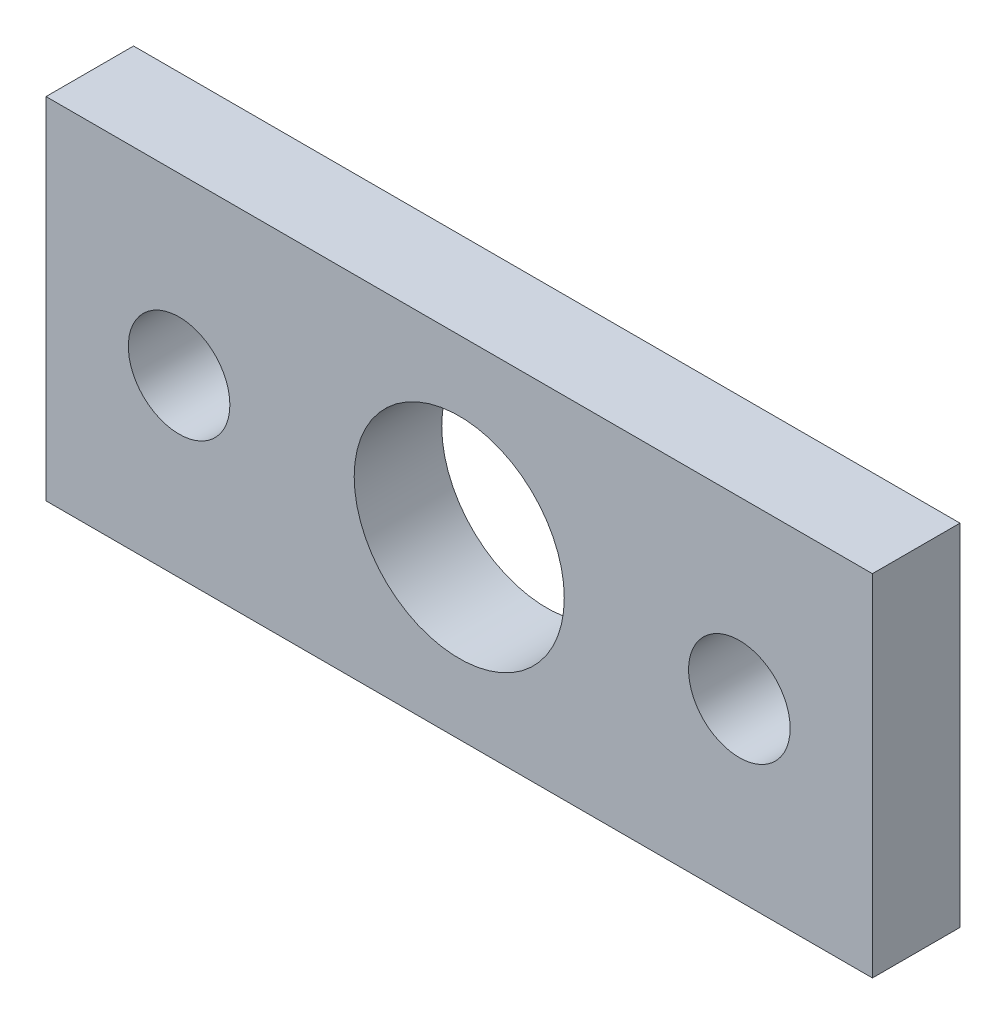
ISO-10303-21;
HEADER;
FILE_DESCRIPTION(('STEP AP214'),'2;1');
FILE_NAME('part.step','',(''),(''),'','','');
FILE_SCHEMA(('AUTOMOTIVE_DESIGN { 1 0 10303 214 1 1 1 1 }'));
ENDSEC;
DATA;
#1=APPLICATION_CONTEXT('core data for automotive mechanical design processes');
#2=APPLICATION_PROTOCOL_DEFINITION('international standard','automotive_design',2000,#1);
#3=PRODUCT_CONTEXT('',#1,'mechanical');
#4=PRODUCT('Part','Part','',(#3));
#5=PRODUCT_RELATED_PRODUCT_CATEGORY('part','',(#4));
#6=PRODUCT_DEFINITION_FORMATION('','',#4);
#7=PRODUCT_DEFINITION_CONTEXT('part definition',#1,'design');
#8=PRODUCT_DEFINITION('design','',#6,#7);
#9=PRODUCT_DEFINITION_SHAPE('','',#8);
#10=(LENGTH_UNIT() NAMED_UNIT(*) SI_UNIT(.MILLI.,.METRE.));
#11=(NAMED_UNIT(*) PLANE_ANGLE_UNIT() SI_UNIT($,.RADIAN.));
#12=(NAMED_UNIT(*) SI_UNIT($,.STERADIAN.) SOLID_ANGLE_UNIT());
#13=UNCERTAINTY_MEASURE_WITH_UNIT(LENGTH_MEASURE(1.E-05),#10,'distance_accuracy_value','');
#14=(GEOMETRIC_REPRESENTATION_CONTEXT(3) GLOBAL_UNCERTAINTY_ASSIGNED_CONTEXT((#13)) GLOBAL_UNIT_ASSIGNED_CONTEXT((#10,
#11,#12)) REPRESENTATION_CONTEXT('',''));
#15=CARTESIAN_POINT('',(0.,0.,0.));
#16=DIRECTION('',(0.,0.,1.));
#17=DIRECTION('',(1.,0.,0.));
#18=AXIS2_PLACEMENT_3D('',#15,#16,#17);
#19=CARTESIAN_POINT('',(0.,0.,2.5));
#20=DIRECTION('',(0.,0.,1.));
#21=DIRECTION('',(1.,0.,0.));
#22=AXIS2_PLACEMENT_3D('',#19,#20,#21);
#23=PLANE('',#22);
#24=CARTESIAN_POINT('',(8.,0.,2.5));
#25=DIRECTION('',(0.,0.,1.));
#26=DIRECTION('',(1.,0.,0.));
#27=AXIS2_PLACEMENT_3D('',#24,#25,#26);
#28=CIRCLE('',#27,1.45);
#29=CARTESIAN_POINT('',(9.45,0.,2.5));
#30=VERTEX_POINT('',#29);
#31=EDGE_CURVE('E122',#30,#30,#28,.T.);
#32=ORIENTED_EDGE('',*,*,#31,.F.);
#33=EDGE_LOOP('',(#32));
#34=FACE_BOUND('',#33,.T.);
#35=DIRECTION('',(0.,-1.,0.));
#36=VECTOR('',#35,1.);
#37=CARTESIAN_POINT('',(-11.8,5.,2.5));
#38=LINE('',#37,#36);
#39=CARTESIAN_POINT('',(-11.8,5.,2.5));
#40=VERTEX_POINT('',#39);
#41=CARTESIAN_POINT('',(-11.8,-5.,2.5));
#42=VERTEX_POINT('',#41);
#43=EDGE_CURVE('E93',#40,#42,#38,.T.);
#44=ORIENTED_EDGE('',*,*,#43,.T.);
#45=DIRECTION('',(1.,0.,0.));
#46=VECTOR('',#45,1.);
#47=CARTESIAN_POINT('',(-11.8,-5.,2.5));
#48=LINE('',#47,#46);
#49=CARTESIAN_POINT('',(11.8,-5.,2.5));
#50=VERTEX_POINT('',#49);
#51=EDGE_CURVE('E88',#42,#50,#48,.T.);
#52=ORIENTED_EDGE('',*,*,#51,.T.);
#53=DIRECTION('',(0.,1.,0.));
#54=VECTOR('',#53,1.);
#55=CARTESIAN_POINT('',(11.8,-5.,2.5));
#56=LINE('',#55,#54);
#57=CARTESIAN_POINT('',(11.8,5.,2.5));
#58=VERTEX_POINT('',#57);
#59=EDGE_CURVE('E91',#50,#58,#56,.T.);
#60=ORIENTED_EDGE('',*,*,#59,.T.);
#61=DIRECTION('',(-1.,0.,0.));
#62=VECTOR('',#61,1.);
#63=CARTESIAN_POINT('',(11.8,5.,2.5));
#64=LINE('',#63,#62);
#65=EDGE_CURVE('E58',#58,#40,#64,.T.);
#66=ORIENTED_EDGE('',*,*,#65,.T.);
#67=EDGE_LOOP('',(#44,#52,#60,#66));
#68=FACE_BOUND('',#67,.T.);
#69=CARTESIAN_POINT('',(-8.,0.,2.5));
#70=DIRECTION('',(0.,0.,1.));
#71=DIRECTION('',(1.,0.,0.));
#72=AXIS2_PLACEMENT_3D('',#69,#70,#71);
#73=CIRCLE('',#72,1.45);
#74=CARTESIAN_POINT('',(-6.55,0.,2.5));
#75=VERTEX_POINT('',#74);
#76=EDGE_CURVE('E108',#75,#75,#73,.T.);
#77=ORIENTED_EDGE('',*,*,#76,.F.);
#78=EDGE_LOOP('',(#77));
#79=FACE_BOUND('',#78,.T.);
#80=CARTESIAN_POINT('',(0.,0.,2.5));
#81=DIRECTION('',(0.,0.,1.));
#82=DIRECTION('',(1.,0.,0.));
#83=AXIS2_PLACEMENT_3D('',#80,#81,#82);
#84=CIRCLE('',#83,3.);
#85=CARTESIAN_POINT('',(3.,0.,2.5));
#86=VERTEX_POINT('',#85);
#87=EDGE_CURVE('E125',#86,#86,#84,.T.);
#88=ORIENTED_EDGE('',*,*,#87,.F.);
#89=EDGE_LOOP('',(#88));
#90=FACE_BOUND('',#89,.T.);
#91=ADVANCED_FACE('F41',(#34,#68,#79,#90),#23,.T.);
#92=CARTESIAN_POINT('',(0.,0.,0.));
#93=DIRECTION('',(0.,0.,1.));
#94=DIRECTION('',(1.,0.,0.));
#95=AXIS2_PLACEMENT_3D('',#92,#93,#94);
#96=PLANE('',#95);
#97=CARTESIAN_POINT('',(-8.,0.,0.));
#98=DIRECTION('',(0.,0.,1.));
#99=DIRECTION('',(1.,0.,0.));
#100=AXIS2_PLACEMENT_3D('',#97,#98,#99);
#101=CIRCLE('',#100,2.8);
#102=CARTESIAN_POINT('',(-5.2,0.,0.));
#103=VERTEX_POINT('',#102);
#104=EDGE_CURVE('E142',#103,#103,#101,.T.);
#105=ORIENTED_EDGE('',*,*,#104,.T.);
#106=EDGE_LOOP('',(#105));
#107=FACE_BOUND('',#106,.T.);
#108=CARTESIAN_POINT('',(8.,0.,0.));
#109=DIRECTION('',(0.,0.,1.));
#110=DIRECTION('',(1.,0.,0.));
#111=AXIS2_PLACEMENT_3D('',#108,#109,#110);
#112=CIRCLE('',#111,2.8);
#113=CARTESIAN_POINT('',(10.8,0.,0.));
#114=VERTEX_POINT('',#113);
#115=EDGE_CURVE('E136',#114,#114,#112,.T.);
#116=ORIENTED_EDGE('',*,*,#115,.T.);
#117=EDGE_LOOP('',(#116));
#118=FACE_BOUND('',#117,.T.);
#119=DIRECTION('',(0.,-1.,0.));
#120=VECTOR('',#119,1.);
#121=CARTESIAN_POINT('',(-11.8,5.,0.));
#122=LINE('',#121,#120);
#123=CARTESIAN_POINT('',(-11.8,5.,0.));
#124=VERTEX_POINT('',#123);
#125=CARTESIAN_POINT('',(-11.8,-5.,0.));
#126=VERTEX_POINT('',#125);
#127=EDGE_CURVE('E105',#124,#126,#122,.T.);
#128=ORIENTED_EDGE('',*,*,#127,.F.);
#129=DIRECTION('',(-1.,0.,0.));
#130=VECTOR('',#129,1.);
#131=CARTESIAN_POINT('',(11.8,5.,0.));
#132=LINE('',#131,#130);
#133=CARTESIAN_POINT('',(11.8,5.,0.));
#134=VERTEX_POINT('',#133);
#135=EDGE_CURVE('E81',#134,#124,#132,.T.);
#136=ORIENTED_EDGE('',*,*,#135,.F.);
#137=DIRECTION('',(0.,1.,0.));
#138=VECTOR('',#137,1.);
#139=CARTESIAN_POINT('',(11.8,-5.,0.));
#140=LINE('',#139,#138);
#141=CARTESIAN_POINT('',(11.8,-5.,0.));
#142=VERTEX_POINT('',#141);
#143=EDGE_CURVE('E75',#142,#134,#140,.T.);
#144=ORIENTED_EDGE('',*,*,#143,.F.);
#145=DIRECTION('',(1.,0.,0.));
#146=VECTOR('',#145,1.);
#147=CARTESIAN_POINT('',(-11.8,-5.,0.));
#148=LINE('',#147,#146);
#149=EDGE_CURVE('E97',#126,#142,#148,.T.);
#150=ORIENTED_EDGE('',*,*,#149,.F.);
#151=EDGE_LOOP('',(#128,#136,#144,#150));
#152=FACE_BOUND('',#151,.T.);
#153=CARTESIAN_POINT('',(0.,0.,0.));
#154=DIRECTION('',(0.,0.,1.));
#155=DIRECTION('',(1.,0.,0.));
#156=AXIS2_PLACEMENT_3D('',#153,#154,#155);
#157=CIRCLE('',#156,3.);
#158=CARTESIAN_POINT('',(3.,0.,0.));
#159=VERTEX_POINT('',#158);
#160=EDGE_CURVE('E126',#159,#159,#157,.T.);
#161=ORIENTED_EDGE('',*,*,#160,.T.);
#162=EDGE_LOOP('',(#161));
#163=FACE_BOUND('',#162,.T.);
#164=ADVANCED_FACE('F116',(#107,#118,#152,#163),#96,.F.);
#165=CARTESIAN_POINT('',(-11.8,5.,2.5));
#166=DIRECTION('',(1.,0.,0.));
#167=DIRECTION('',(0.,0.,-1.));
#168=AXIS2_PLACEMENT_3D('',#165,#166,#167);
#169=PLANE('',#168);
#170=ORIENTED_EDGE('',*,*,#127,.T.);
#171=DIRECTION('',(0.,0.,-1.));
#172=VECTOR('',#171,1.);
#173=CARTESIAN_POINT('',(-11.8,-5.,2.5));
#174=LINE('',#173,#172);
#175=EDGE_CURVE('E11',#42,#126,#174,.T.);
#176=ORIENTED_EDGE('',*,*,#175,.F.);
#177=ORIENTED_EDGE('',*,*,#43,.F.);
#178=DIRECTION('',(0.,0.,-1.));
#179=VECTOR('',#178,1.);
#180=CARTESIAN_POINT('',(-11.8,5.,2.5));
#181=LINE('',#180,#179);
#182=EDGE_CURVE('E101',#40,#124,#181,.T.);
#183=ORIENTED_EDGE('',*,*,#182,.T.);
#184=EDGE_LOOP('',(#170,#176,#177,#183));
#185=FACE_BOUND('',#184,.T.);
#186=ADVANCED_FACE('F43',(#185),#169,.F.);
#187=CARTESIAN_POINT('',(-11.8,-5.,2.5));
#188=DIRECTION('',(0.,1.,0.));
#189=DIRECTION('',(0.,0.,1.));
#190=AXIS2_PLACEMENT_3D('',#187,#188,#189);
#191=PLANE('',#190);
#192=ORIENTED_EDGE('',*,*,#149,.T.);
#193=DIRECTION('',(0.,0.,-1.));
#194=VECTOR('',#193,1.);
#195=CARTESIAN_POINT('',(11.8,-5.,2.5));
#196=LINE('',#195,#194);
#197=EDGE_CURVE('E50',#50,#142,#196,.T.);
#198=ORIENTED_EDGE('',*,*,#197,.F.);
#199=ORIENTED_EDGE('',*,*,#51,.F.);
#200=ORIENTED_EDGE('',*,*,#175,.T.);
#201=EDGE_LOOP('',(#192,#198,#199,#200));
#202=FACE_BOUND('',#201,.T.);
#203=ADVANCED_FACE('F96',(#202),#191,.F.);
#204=CARTESIAN_POINT('',(11.8,-5.,2.5));
#205=DIRECTION('',(-1.,0.,0.));
#206=DIRECTION('',(0.,0.,1.));
#207=AXIS2_PLACEMENT_3D('',#204,#205,#206);
#208=PLANE('',#207);
#209=ORIENTED_EDGE('',*,*,#143,.T.);
#210=DIRECTION('',(0.,0.,-1.));
#211=VECTOR('',#210,1.);
#212=CARTESIAN_POINT('',(11.8,5.,2.5));
#213=LINE('',#212,#211);
#214=EDGE_CURVE('E98',#58,#134,#213,.T.);
#215=ORIENTED_EDGE('',*,*,#214,.F.);
#216=ORIENTED_EDGE('',*,*,#59,.F.);
#217=ORIENTED_EDGE('',*,*,#197,.T.);
#218=EDGE_LOOP('',(#209,#215,#216,#217));
#219=FACE_BOUND('',#218,.T.);
#220=ADVANCED_FACE('F99',(#219),#208,.F.);
#221=CARTESIAN_POINT('',(11.8,5.,2.5));
#222=DIRECTION('',(0.,-1.,0.));
#223=DIRECTION('',(0.,0.,-1.));
#224=AXIS2_PLACEMENT_3D('',#221,#222,#223);
#225=PLANE('',#224);
#226=ORIENTED_EDGE('',*,*,#135,.T.);
#227=ORIENTED_EDGE('',*,*,#182,.F.);
#228=ORIENTED_EDGE('',*,*,#65,.F.);
#229=ORIENTED_EDGE('',*,*,#214,.T.);
#230=EDGE_LOOP('',(#226,#227,#228,#229));
#231=FACE_BOUND('',#230,.T.);
#232=ADVANCED_FACE('F113',(#231),#225,.F.);
#233=CARTESIAN_POINT('',(-8.,0.,2.5));
#234=DIRECTION('',(0.,0.,-1.));
#235=DIRECTION('',(-1.,0.,0.));
#236=AXIS2_PLACEMENT_3D('',#233,#234,#235);
#237=CYLINDRICAL_SURFACE('',#236,1.45);
#238=ORIENTED_EDGE('',*,*,#76,.T.);
#239=EDGE_LOOP('',(#238));
#240=FACE_BOUND('',#239,.T.);
#241=CARTESIAN_POINT('',(-8.,0.,-1.));
#242=DIRECTION('',(0.,0.,1.));
#243=DIRECTION('',(1.,0.,0.));
#244=AXIS2_PLACEMENT_3D('',#241,#242,#243);
#245=CIRCLE('',#244,1.45);
#246=CARTESIAN_POINT('',(-6.55,0.,-1.));
#247=VERTEX_POINT('',#246);
#248=EDGE_CURVE('E135',#247,#247,#245,.T.);
#249=ORIENTED_EDGE('',*,*,#248,.F.);
#250=EDGE_LOOP('',(#249));
#251=FACE_BOUND('',#250,.T.);
#252=ADVANCED_FACE('F153',(#240,#251),#237,.F.);
#253=CARTESIAN_POINT('',(8.,0.,2.5));
#254=DIRECTION('',(0.,0.,-1.));
#255=DIRECTION('',(-1.,0.,0.));
#256=AXIS2_PLACEMENT_3D('',#253,#254,#255);
#257=CYLINDRICAL_SURFACE('',#256,1.45);
#258=ORIENTED_EDGE('',*,*,#31,.T.);
#259=EDGE_LOOP('',(#258));
#260=FACE_BOUND('',#259,.T.);
#261=CARTESIAN_POINT('',(8.,0.,-1.));
#262=DIRECTION('',(0.,0.,1.));
#263=DIRECTION('',(1.,0.,0.));
#264=AXIS2_PLACEMENT_3D('',#261,#262,#263);
#265=CIRCLE('',#264,1.45);
#266=CARTESIAN_POINT('',(9.45,0.,-1.));
#267=VERTEX_POINT('',#266);
#268=EDGE_CURVE('E132',#267,#267,#265,.T.);
#269=ORIENTED_EDGE('',*,*,#268,.F.);
#270=EDGE_LOOP('',(#269));
#271=FACE_BOUND('',#270,.T.);
#272=ADVANCED_FACE('F155',(#260,#271),#257,.F.);
#273=CARTESIAN_POINT('',(0.,0.,2.5));
#274=DIRECTION('',(0.,0.,-1.));
#275=DIRECTION('',(-1.,0.,0.));
#276=AXIS2_PLACEMENT_3D('',#273,#274,#275);
#277=CYLINDRICAL_SURFACE('',#276,3.);
#278=ORIENTED_EDGE('',*,*,#87,.T.);
#279=EDGE_LOOP('',(#278));
#280=FACE_BOUND('',#279,.T.);
#281=ORIENTED_EDGE('',*,*,#160,.F.);
#282=EDGE_LOOP('',(#281));
#283=FACE_BOUND('',#282,.T.);
#284=ADVANCED_FACE('F162',(#280,#283),#277,.F.);
#285=CARTESIAN_POINT('',(8.,0.,-1.));
#286=DIRECTION('',(0.,0.,1.));
#287=DIRECTION('',(1.,0.,0.));
#288=AXIS2_PLACEMENT_3D('',#285,#286,#287);
#289=CYLINDRICAL_SURFACE('',#288,2.8);
#290=CARTESIAN_POINT('',(8.,0.,-1.));
#291=DIRECTION('',(0.,0.,1.));
#292=DIRECTION('',(1.,0.,0.));
#293=AXIS2_PLACEMENT_3D('',#290,#291,#292);
#294=CIRCLE('',#293,2.8);
#295=CARTESIAN_POINT('',(10.8,0.,-1.));
#296=VERTEX_POINT('',#295);
#297=EDGE_CURVE('E137',#296,#296,#294,.T.);
#298=ORIENTED_EDGE('',*,*,#297,.T.);
#299=EDGE_LOOP('',(#298));
#300=FACE_BOUND('',#299,.T.);
#301=ORIENTED_EDGE('',*,*,#115,.F.);
#302=EDGE_LOOP('',(#301));
#303=FACE_BOUND('',#302,.T.);
#304=ADVANCED_FACE('F228',(#300,#303),#289,.T.);
#305=CARTESIAN_POINT('',(8.,0.,-1.));
#306=DIRECTION('',(0.,0.,1.));
#307=DIRECTION('',(1.,0.,0.));
#308=AXIS2_PLACEMENT_3D('',#305,#306,#307);
#309=PLANE('',#308);
#310=ORIENTED_EDGE('',*,*,#268,.T.);
#311=EDGE_LOOP('',(#310));
#312=FACE_BOUND('',#311,.T.);
#313=ORIENTED_EDGE('',*,*,#297,.F.);
#314=EDGE_LOOP('',(#313));
#315=FACE_BOUND('',#314,.T.);
#316=ADVANCED_FACE('F238',(#312,#315),#309,.F.);
#317=CARTESIAN_POINT('',(-8.,0.,-1.));
#318=DIRECTION('',(0.,0.,1.));
#319=DIRECTION('',(1.,0.,0.));
#320=AXIS2_PLACEMENT_3D('',#317,#318,#319);
#321=CYLINDRICAL_SURFACE('',#320,2.8);
#322=CARTESIAN_POINT('',(-8.,0.,-1.));
#323=DIRECTION('',(0.,0.,1.));
#324=DIRECTION('',(1.,0.,0.));
#325=AXIS2_PLACEMENT_3D('',#322,#323,#324);
#326=CIRCLE('',#325,2.8);
#327=CARTESIAN_POINT('',(-5.2,0.,-1.));
#328=VERTEX_POINT('',#327);
#329=EDGE_CURVE('E129',#328,#328,#326,.T.);
#330=ORIENTED_EDGE('',*,*,#329,.T.);
#331=EDGE_LOOP('',(#330));
#332=FACE_BOUND('',#331,.T.);
#333=ORIENTED_EDGE('',*,*,#104,.F.);
#334=EDGE_LOOP('',(#333));
#335=FACE_BOUND('',#334,.T.);
#336=ADVANCED_FACE('F247',(#332,#335),#321,.T.);
#337=CARTESIAN_POINT('',(-8.,0.,-1.));
#338=DIRECTION('',(0.,0.,1.));
#339=DIRECTION('',(1.,0.,0.));
#340=AXIS2_PLACEMENT_3D('',#337,#338,#339);
#341=PLANE('',#340);
#342=ORIENTED_EDGE('',*,*,#248,.T.);
#343=EDGE_LOOP('',(#342));
#344=FACE_BOUND('',#343,.T.);
#345=ORIENTED_EDGE('',*,*,#329,.F.);
#346=EDGE_LOOP('',(#345));
#347=FACE_BOUND('',#346,.T.);
#348=ADVANCED_FACE('F150',(#344,#347),#341,.F.);
#349=CLOSED_SHELL('',(#91,#164,#186,#203,#220,#232,#252,#272,#284,#304,#316,#336,#348));
#350=MANIFOLD_SOLID_BREP('B2',#349);
#351=ADVANCED_BREP_SHAPE_REPRESENTATION('',(#18,#350),#14);
#352=SHAPE_DEFINITION_REPRESENTATION(#9,#351);
ENDSEC;
END-ISO-10303-21;
